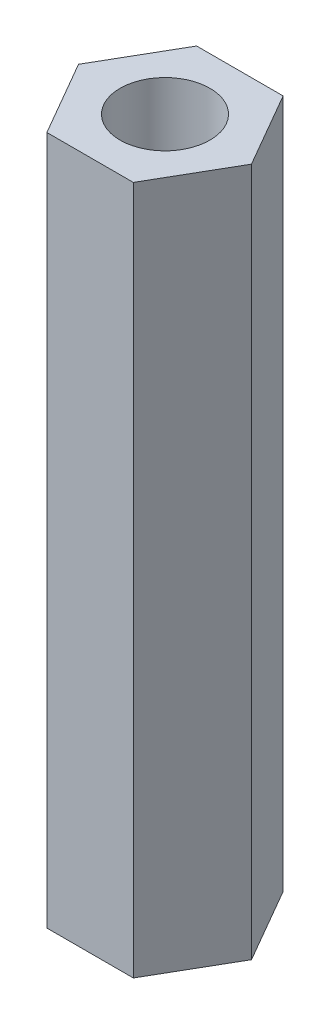
ISO-10303-21;
HEADER;
FILE_DESCRIPTION(('STEP AP214'),'2;1');
FILE_NAME('part.step','',(''),(''),'','','');
FILE_SCHEMA(('AUTOMOTIVE_DESIGN { 1 0 10303 214 1 1 1 1 }'));
ENDSEC;
DATA;
#1=APPLICATION_CONTEXT('core data for automotive mechanical design processes');
#2=APPLICATION_PROTOCOL_DEFINITION('international standard','automotive_design',2000,#1);
#3=PRODUCT_CONTEXT('',#1,'mechanical');
#4=PRODUCT('Part','Part','',(#3));
#5=PRODUCT_RELATED_PRODUCT_CATEGORY('part','',(#4));
#6=PRODUCT_DEFINITION_FORMATION('','',#4);
#7=PRODUCT_DEFINITION_CONTEXT('part definition',#1,'design');
#8=PRODUCT_DEFINITION('design','',#6,#7);
#9=PRODUCT_DEFINITION_SHAPE('','',#8);
#10=(LENGTH_UNIT() NAMED_UNIT(*) SI_UNIT(.MILLI.,.METRE.));
#11=(NAMED_UNIT(*) PLANE_ANGLE_UNIT() SI_UNIT($,.RADIAN.));
#12=(NAMED_UNIT(*) SI_UNIT($,.STERADIAN.) SOLID_ANGLE_UNIT());
#13=UNCERTAINTY_MEASURE_WITH_UNIT(LENGTH_MEASURE(1.E-05),#10,'distance_accuracy_value','');
#14=(GEOMETRIC_REPRESENTATION_CONTEXT(3) GLOBAL_UNCERTAINTY_ASSIGNED_CONTEXT((#13)) GLOBAL_UNIT_ASSIGNED_CONTEXT((#10,
#11,#12)) REPRESENTATION_CONTEXT('',''));
#15=CARTESIAN_POINT('',(0.,0.,0.));
#16=DIRECTION('',(0.,0.,1.));
#17=DIRECTION('',(1.,0.,0.));
#18=AXIS2_PLACEMENT_3D('',#15,#16,#17);
#19=CARTESIAN_POINT('',(0.,23.,5.00000000000001));
#20=DIRECTION('',(0.,-1.,0.));
#21=DIRECTION('',(0.,0.,-1.));
#22=AXIS2_PLACEMENT_3D('',#19,#20,#21);
#23=PLANE('',#22);
#24=DIRECTION('',(0.499999999999999,0.,-0.866025403784439));
#25=VECTOR('',#24,1.);
#26=CARTESIAN_POINT('',(1.44337567297406,23.,2.50000000000002));
#27=LINE('',#26,#25);
#28=CARTESIAN_POINT('',(1.44337567297406,23.,2.50000000000002));
#29=VERTEX_POINT('',#28);
#30=CARTESIAN_POINT('',(2.88675134594812,23.,0.));
#31=VERTEX_POINT('',#30);
#32=EDGE_CURVE('E129',#29,#31,#27,.T.);
#33=ORIENTED_EDGE('',*,*,#32,.T.);
#34=DIRECTION('',(-0.499999999999998,0.,-0.86602540378444));
#35=VECTOR('',#34,1.);
#36=CARTESIAN_POINT('',(2.88675134594812,23.,0.));
#37=LINE('',#36,#35);
#38=CARTESIAN_POINT('',(1.44337567297405,23.,-2.50000000000003));
#39=VERTEX_POINT('',#38);
#40=EDGE_CURVE('E87',#31,#39,#37,.T.);
#41=ORIENTED_EDGE('',*,*,#40,.T.);
#42=DIRECTION('',(-1.,0.,0.));
#43=VECTOR('',#42,1.);
#44=CARTESIAN_POINT('',(1.44337567297405,23.,-2.50000000000003));
#45=LINE('',#44,#43);
#46=CARTESIAN_POINT('',(-1.44337567297407,23.,-2.50000000000003));
#47=VERTEX_POINT('',#46);
#48=EDGE_CURVE('E100',#39,#47,#45,.T.);
#49=ORIENTED_EDGE('',*,*,#48,.T.);
#50=DIRECTION('',(-0.499999999999999,0.,0.86602540378444));
#51=VECTOR('',#50,1.);
#52=CARTESIAN_POINT('',(-1.44337567297407,23.,-2.50000000000003));
#53=LINE('',#52,#51);
#54=CARTESIAN_POINT('',(-2.88675134594815,23.,0.));
#55=VERTEX_POINT('',#54);
#56=EDGE_CURVE('E94',#47,#55,#53,.T.);
#57=ORIENTED_EDGE('',*,*,#56,.T.);
#58=DIRECTION('',(0.500000000000002,0.,0.866025403784437));
#59=VECTOR('',#58,1.);
#60=CARTESIAN_POINT('',(-2.88675134594815,23.,0.));
#61=LINE('',#60,#59);
#62=CARTESIAN_POINT('',(-1.44337567297407,23.,2.50000000000002));
#63=VERTEX_POINT('',#62);
#64=EDGE_CURVE('E98',#55,#63,#61,.T.);
#65=ORIENTED_EDGE('',*,*,#64,.T.);
#66=DIRECTION('',(1.,0.,0.));
#67=VECTOR('',#66,1.);
#68=CARTESIAN_POINT('',(-1.44337567297407,23.,2.50000000000002));
#69=LINE('',#68,#67);
#70=EDGE_CURVE('E50',#63,#29,#69,.T.);
#71=ORIENTED_EDGE('',*,*,#70,.T.);
#72=EDGE_LOOP('',(#33,#41,#49,#57,#65,#71));
#73=FACE_BOUND('',#72,.T.);
#74=CARTESIAN_POINT('',(0.,23.,0.));
#75=DIRECTION('',(0.,1.,0.));
#76=DIRECTION('',(0.,0.,1.));
#77=AXIS2_PLACEMENT_3D('',#74,#75,#76);
#78=CIRCLE('',#77,1.5);
#79=CARTESIAN_POINT('',(0.,23.,1.5));
#80=VERTEX_POINT('',#79);
#81=EDGE_CURVE('E122',#80,#80,#78,.T.);
#82=ORIENTED_EDGE('',*,*,#81,.F.);
#83=EDGE_LOOP('',(#82));
#84=FACE_BOUND('',#83,.T.);
#85=ADVANCED_FACE('F33',(#73,#84),#23,.F.);
#86=CARTESIAN_POINT('',(0.,0.,5.00000000000001));
#87=DIRECTION('',(0.,-1.,0.));
#88=DIRECTION('',(0.,0.,-1.));
#89=AXIS2_PLACEMENT_3D('',#86,#87,#88);
#90=PLANE('',#89);
#91=DIRECTION('',(0.499999999999999,0.,-0.866025403784439));
#92=VECTOR('',#91,1.);
#93=CARTESIAN_POINT('',(1.44337567297406,0.,2.50000000000002));
#94=LINE('',#93,#92);
#95=CARTESIAN_POINT('',(1.44337567297406,0.,2.50000000000002));
#96=VERTEX_POINT('',#95);
#97=CARTESIAN_POINT('',(2.88675134594812,0.,0.));
#98=VERTEX_POINT('',#97);
#99=EDGE_CURVE('E118',#96,#98,#94,.T.);
#100=ORIENTED_EDGE('',*,*,#99,.F.);
#101=DIRECTION('',(1.,0.,0.));
#102=VECTOR('',#101,1.);
#103=CARTESIAN_POINT('',(-1.44337567297407,0.,2.50000000000002));
#104=LINE('',#103,#102);
#105=CARTESIAN_POINT('',(-1.44337567297407,0.,2.50000000000002));
#106=VERTEX_POINT('',#105);
#107=EDGE_CURVE('E79',#106,#96,#104,.T.);
#108=ORIENTED_EDGE('',*,*,#107,.F.);
#109=DIRECTION('',(0.500000000000002,0.,0.866025403784437));
#110=VECTOR('',#109,1.);
#111=CARTESIAN_POINT('',(-2.88675134594815,0.,0.));
#112=LINE('',#111,#110);
#113=CARTESIAN_POINT('',(-2.88675134594815,0.,0.));
#114=VERTEX_POINT('',#113);
#115=EDGE_CURVE('E73',#114,#106,#112,.T.);
#116=ORIENTED_EDGE('',*,*,#115,.F.);
#117=DIRECTION('',(-0.499999999999999,0.,0.86602540378444));
#118=VECTOR('',#117,1.);
#119=CARTESIAN_POINT('',(-1.44337567297407,0.,-2.50000000000003));
#120=LINE('',#119,#118);
#121=CARTESIAN_POINT('',(-1.44337567297407,0.,-2.50000000000003));
#122=VERTEX_POINT('',#121);
#123=EDGE_CURVE('E108',#122,#114,#120,.T.);
#124=ORIENTED_EDGE('',*,*,#123,.F.);
#125=DIRECTION('',(-1.,0.,0.));
#126=VECTOR('',#125,1.);
#127=CARTESIAN_POINT('',(1.44337567297405,0.,-2.50000000000003));
#128=LINE('',#127,#126);
#129=CARTESIAN_POINT('',(1.44337567297405,0.,-2.50000000000003));
#130=VERTEX_POINT('',#129);
#131=EDGE_CURVE('E124',#130,#122,#128,.T.);
#132=ORIENTED_EDGE('',*,*,#131,.F.);
#133=DIRECTION('',(-0.499999999999998,0.,-0.86602540378444));
#134=VECTOR('',#133,1.);
#135=CARTESIAN_POINT('',(2.88675134594812,0.,0.));
#136=LINE('',#135,#134);
#137=EDGE_CURVE('E121',#98,#130,#136,.T.);
#138=ORIENTED_EDGE('',*,*,#137,.F.);
#139=EDGE_LOOP('',(#100,#108,#116,#124,#132,#138));
#140=FACE_BOUND('',#139,.T.);
#141=CARTESIAN_POINT('',(0.,0.,0.));
#142=DIRECTION('',(0.,1.,0.));
#143=DIRECTION('',(0.,0.,1.));
#144=AXIS2_PLACEMENT_3D('',#141,#142,#143);
#145=CIRCLE('',#144,1.5);
#146=CARTESIAN_POINT('',(0.,0.,1.5));
#147=VERTEX_POINT('',#146);
#148=EDGE_CURVE('E222',#147,#147,#145,.T.);
#149=ORIENTED_EDGE('',*,*,#148,.T.);
#150=EDGE_LOOP('',(#149));
#151=FACE_BOUND('',#150,.T.);
#152=ADVANCED_FACE('F138',(#140,#151),#90,.T.);
#153=CARTESIAN_POINT('',(1.44337567297406,23.,2.50000000000002));
#154=DIRECTION('',(-0.866025403784439,0.,-0.499999999999999));
#155=DIRECTION('',(-0.499999999999999,0.,0.866025403784439));
#156=AXIS2_PLACEMENT_3D('',#153,#154,#155);
#157=PLANE('',#156);
#158=ORIENTED_EDGE('',*,*,#99,.T.);
#159=DIRECTION('',(0.,-1.,0.));
#160=VECTOR('',#159,1.);
#161=CARTESIAN_POINT('',(2.88675134594812,23.,0.));
#162=LINE('',#161,#160);
#163=EDGE_CURVE('E11',#31,#98,#162,.T.);
#164=ORIENTED_EDGE('',*,*,#163,.F.);
#165=ORIENTED_EDGE('',*,*,#32,.F.);
#166=DIRECTION('',(0.,-1.,0.));
#167=VECTOR('',#166,1.);
#168=CARTESIAN_POINT('',(1.44337567297406,23.,2.50000000000002));
#169=LINE('',#168,#167);
#170=EDGE_CURVE('E114',#29,#96,#169,.T.);
#171=ORIENTED_EDGE('',*,*,#170,.T.);
#172=EDGE_LOOP('',(#158,#164,#165,#171));
#173=FACE_BOUND('',#172,.T.);
#174=ADVANCED_FACE('F35',(#173),#157,.F.);
#175=CARTESIAN_POINT('',(2.88675134594812,23.,0.));
#176=DIRECTION('',(-0.866025403784439,0.,0.499999999999998));
#177=DIRECTION('',(0.499999999999998,0.,0.86602540378444));
#178=AXIS2_PLACEMENT_3D('',#175,#176,#177);
#179=PLANE('',#178);
#180=ORIENTED_EDGE('',*,*,#137,.T.);
#181=DIRECTION('',(0.,-1.,0.));
#182=VECTOR('',#181,1.);
#183=CARTESIAN_POINT('',(1.44337567297405,23.,-2.50000000000003));
#184=LINE('',#183,#182);
#185=EDGE_CURVE('E42',#39,#130,#184,.T.);
#186=ORIENTED_EDGE('',*,*,#185,.F.);
#187=ORIENTED_EDGE('',*,*,#40,.F.);
#188=ORIENTED_EDGE('',*,*,#163,.T.);
#189=EDGE_LOOP('',(#180,#186,#187,#188));
#190=FACE_BOUND('',#189,.T.);
#191=ADVANCED_FACE('F163',(#190),#179,.F.);
#192=CARTESIAN_POINT('',(1.44337567297405,23.,-2.50000000000003));
#193=DIRECTION('',(0.,0.,1.));
#194=DIRECTION('',(1.,0.,0.));
#195=AXIS2_PLACEMENT_3D('',#192,#193,#194);
#196=PLANE('',#195);
#197=ORIENTED_EDGE('',*,*,#131,.T.);
#198=DIRECTION('',(0.,-1.,0.));
#199=VECTOR('',#198,1.);
#200=CARTESIAN_POINT('',(-1.44337567297407,23.,-2.50000000000003));
#201=LINE('',#200,#199);
#202=EDGE_CURVE('E109',#47,#122,#201,.T.);
#203=ORIENTED_EDGE('',*,*,#202,.F.);
#204=ORIENTED_EDGE('',*,*,#48,.F.);
#205=ORIENTED_EDGE('',*,*,#185,.T.);
#206=EDGE_LOOP('',(#197,#203,#204,#205));
#207=FACE_BOUND('',#206,.T.);
#208=ADVANCED_FACE('F135',(#207),#196,.F.);
#209=CARTESIAN_POINT('',(-1.44337567297407,23.,-2.50000000000003));
#210=DIRECTION('',(0.866025403784439,0.,0.499999999999998));
#211=DIRECTION('',(0.499999999999999,0.,-0.86602540378444));
#212=AXIS2_PLACEMENT_3D('',#209,#210,#211);
#213=PLANE('',#212);
#214=ORIENTED_EDGE('',*,*,#123,.T.);
#215=DIRECTION('',(0.,-1.,0.));
#216=VECTOR('',#215,1.);
#217=CARTESIAN_POINT('',(-2.88675134594815,23.,0.));
#218=LINE('',#217,#216);
#219=EDGE_CURVE('E105',#55,#114,#218,.T.);
#220=ORIENTED_EDGE('',*,*,#219,.F.);
#221=ORIENTED_EDGE('',*,*,#56,.F.);
#222=ORIENTED_EDGE('',*,*,#202,.T.);
#223=EDGE_LOOP('',(#214,#220,#221,#222));
#224=FACE_BOUND('',#223,.T.);
#225=ADVANCED_FACE('F106',(#224),#213,.F.);
#226=CARTESIAN_POINT('',(-2.88675134594815,23.,0.));
#227=DIRECTION('',(0.866025403784437,0.,-0.500000000000002));
#228=DIRECTION('',(-0.500000000000002,0.,-0.866025403784437));
#229=AXIS2_PLACEMENT_3D('',#226,#227,#228);
#230=PLANE('',#229);
#231=ORIENTED_EDGE('',*,*,#115,.T.);
#232=DIRECTION('',(0.,-1.,0.));
#233=VECTOR('',#232,1.);
#234=CARTESIAN_POINT('',(-1.44337567297407,23.,2.50000000000002));
#235=LINE('',#234,#233);
#236=EDGE_CURVE('E110',#63,#106,#235,.T.);
#237=ORIENTED_EDGE('',*,*,#236,.F.);
#238=ORIENTED_EDGE('',*,*,#64,.F.);
#239=ORIENTED_EDGE('',*,*,#219,.T.);
#240=EDGE_LOOP('',(#231,#237,#238,#239));
#241=FACE_BOUND('',#240,.T.);
#242=ADVANCED_FACE('F112',(#241),#230,.F.);
#243=CARTESIAN_POINT('',(-1.44337567297407,23.,2.50000000000002));
#244=DIRECTION('',(0.,0.,-1.));
#245=DIRECTION('',(-1.,0.,0.));
#246=AXIS2_PLACEMENT_3D('',#243,#244,#245);
#247=PLANE('',#246);
#248=ORIENTED_EDGE('',*,*,#107,.T.);
#249=ORIENTED_EDGE('',*,*,#170,.F.);
#250=ORIENTED_EDGE('',*,*,#70,.F.);
#251=ORIENTED_EDGE('',*,*,#236,.T.);
#252=EDGE_LOOP('',(#248,#249,#250,#251));
#253=FACE_BOUND('',#252,.T.);
#254=ADVANCED_FACE('F143',(#253),#247,.F.);
#255=CARTESIAN_POINT('',(0.,23.,0.));
#256=DIRECTION('',(0.,-1.,0.));
#257=DIRECTION('',(0.,0.,-1.));
#258=AXIS2_PLACEMENT_3D('',#255,#256,#257);
#259=CYLINDRICAL_SURFACE('',#258,1.5);
#260=ORIENTED_EDGE('',*,*,#81,.T.);
#261=EDGE_LOOP('',(#260));
#262=FACE_BOUND('',#261,.T.);
#263=ORIENTED_EDGE('',*,*,#148,.F.);
#264=EDGE_LOOP('',(#263));
#265=FACE_BOUND('',#264,.T.);
#266=ADVANCED_FACE('F145',(#262,#265),#259,.F.);
#267=CLOSED_SHELL('',(#85,#152,#174,#191,#208,#225,#242,#254,#266));
#268=MANIFOLD_SOLID_BREP('B2',#267);
#269=ADVANCED_BREP_SHAPE_REPRESENTATION('',(#18,#268),#14);
#270=SHAPE_DEFINITION_REPRESENTATION(#9,#269);
ENDSEC;
END-ISO-10303-21;
